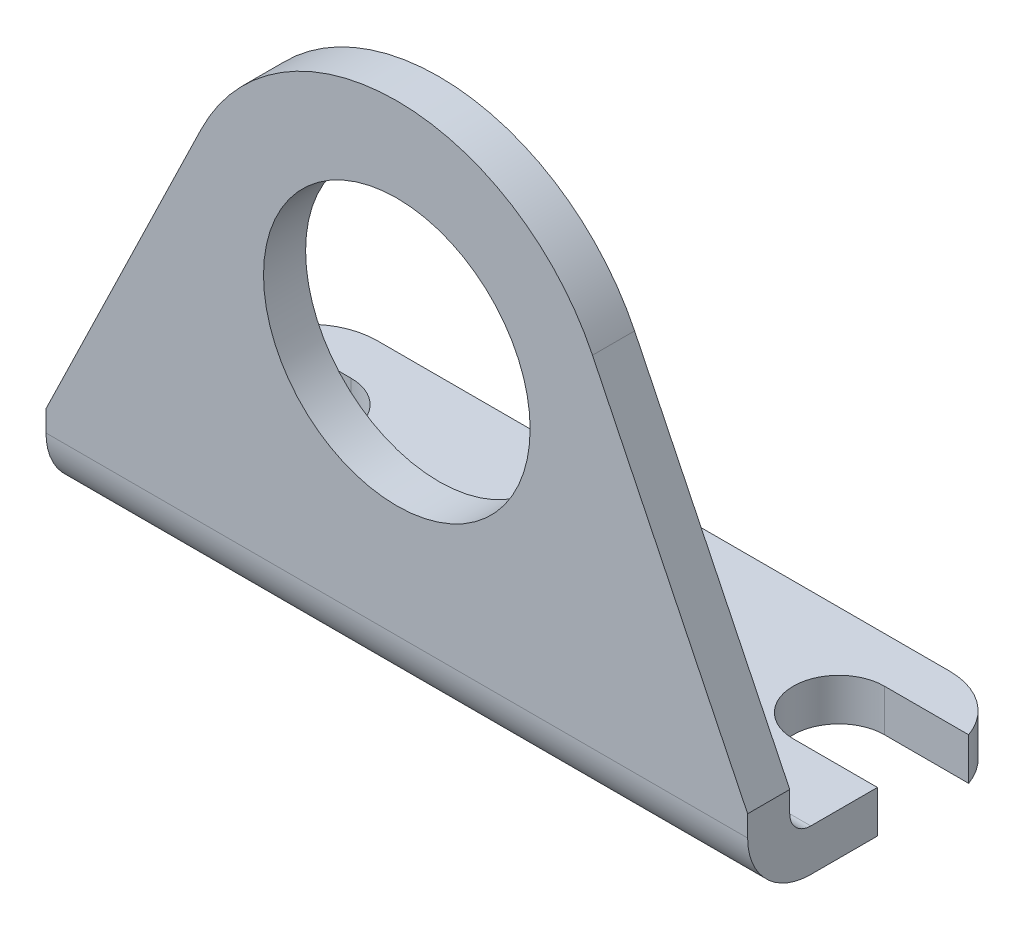
ISO-10303-21;
HEADER;
FILE_DESCRIPTION(('STEP AP214'),'2;1');
FILE_NAME('part.step','',(''),(''),'','','');
FILE_SCHEMA(('AUTOMOTIVE_DESIGN { 1 0 10303 214 1 1 1 1 }'));
ENDSEC;
DATA;
#1=APPLICATION_CONTEXT('core data for automotive mechanical design processes');
#2=APPLICATION_PROTOCOL_DEFINITION('international standard','automotive_design',2000,#1);
#3=PRODUCT_CONTEXT('',#1,'mechanical');
#4=PRODUCT('Part','Part','',(#3));
#5=PRODUCT_RELATED_PRODUCT_CATEGORY('part','',(#4));
#6=PRODUCT_DEFINITION_FORMATION('','',#4);
#7=PRODUCT_DEFINITION_CONTEXT('part definition',#1,'design');
#8=PRODUCT_DEFINITION('design','',#6,#7);
#9=PRODUCT_DEFINITION_SHAPE('','',#8);
#10=(LENGTH_UNIT() NAMED_UNIT(*) SI_UNIT(.MILLI.,.METRE.));
#11=(NAMED_UNIT(*) PLANE_ANGLE_UNIT() SI_UNIT($,.RADIAN.));
#12=(NAMED_UNIT(*) SI_UNIT($,.STERADIAN.) SOLID_ANGLE_UNIT());
#13=UNCERTAINTY_MEASURE_WITH_UNIT(LENGTH_MEASURE(1.E-05),#10,'distance_accuracy_value','');
#14=(GEOMETRIC_REPRESENTATION_CONTEXT(3) GLOBAL_UNCERTAINTY_ASSIGNED_CONTEXT((#13)) GLOBAL_UNIT_ASSIGNED_CONTEXT((#10,
#11,#12)) REPRESENTATION_CONTEXT('',''));
#15=CARTESIAN_POINT('',(0.,0.,0.));
#16=DIRECTION('',(0.,0.,1.));
#17=DIRECTION('',(1.,0.,0.));
#18=AXIS2_PLACEMENT_3D('',#15,#16,#17);
#19=CARTESIAN_POINT('',(-12.7,0.,6.35));
#20=DIRECTION('',(0.,1.,0.));
#21=DIRECTION('',(0.,0.,1.));
#22=AXIS2_PLACEMENT_3D('',#19,#20,#21);
#23=PLANE('',#22);
#24=DIRECTION('',(-1.,0.,0.));
#25=VECTOR('',#24,1.);
#26=CARTESIAN_POINT('',(-9.652,0.,-1.651));
#27=LINE('',#26,#25);
#28=CARTESIAN_POINT('',(-9.652,0.,-1.651));
#29=VERTEX_POINT('',#28);
#30=CARTESIAN_POINT('',(-12.6999999999999,0.,-1.651));
#31=VERTEX_POINT('',#30);
#32=EDGE_CURVE('E235',#29,#31,#27,.T.);
#33=ORIENTED_EDGE('',*,*,#32,.T.);
#34=CARTESIAN_POINT('',(-10.365133408522,0.,-0.825499999999999));
#35=DIRECTION('',(0.,1.,0.));
#36=DIRECTION('',(0.,0.,1.));
#37=AXIS2_PLACEMENT_3D('',#34,#35,#36);
#38=CIRCLE('',#37,2.4765);
#39=CARTESIAN_POINT('',(-10.365133408522,0.,-3.302));
#40=VERTEX_POINT('',#39);
#41=EDGE_CURVE('E204',#31,#40,#38,.F.);
#42=ORIENTED_EDGE('',*,*,#41,.T.);
#43=DIRECTION('',(1.,0.,0.));
#44=VECTOR('',#43,1.);
#45=CARTESIAN_POINT('',(-12.7,0.,-3.302));
#46=LINE('',#45,#44);
#47=CARTESIAN_POINT('',(10.365133408522,0.,-3.302));
#48=VERTEX_POINT('',#47);
#49=EDGE_CURVE('E211',#40,#48,#46,.T.);
#50=ORIENTED_EDGE('',*,*,#49,.T.);
#51=CARTESIAN_POINT('',(10.365133408522,0.,-0.825499999999999));
#52=DIRECTION('',(0.,1.,0.));
#53=DIRECTION('',(0.,0.,1.));
#54=AXIS2_PLACEMENT_3D('',#51,#52,#53);
#55=CIRCLE('',#54,2.4765);
#56=CARTESIAN_POINT('',(12.7,0.,-1.651));
#57=VERTEX_POINT('',#56);
#58=EDGE_CURVE('E197',#48,#57,#55,.F.);
#59=ORIENTED_EDGE('',*,*,#58,.T.);
#60=DIRECTION('',(-1.,0.,0.));
#61=VECTOR('',#60,1.);
#62=CARTESIAN_POINT('',(9.652,0.,-1.65099999999999));
#63=LINE('',#62,#61);
#64=CARTESIAN_POINT('',(9.652,0.,-1.65099999999999));
#65=VERTEX_POINT('',#64);
#66=EDGE_CURVE('E230',#57,#65,#63,.T.);
#67=ORIENTED_EDGE('',*,*,#66,.T.);
#68=CARTESIAN_POINT('',(9.652,0.,0.));
#69=DIRECTION('',(0.,1.,0.));
#70=DIRECTION('',(0.,0.,1.));
#71=AXIS2_PLACEMENT_3D('',#68,#69,#70);
#72=CIRCLE('',#71,1.65099999999999);
#73=CARTESIAN_POINT('',(9.652,0.,1.65099999999999));
#74=VERTEX_POINT('',#73);
#75=EDGE_CURVE('E284',#65,#74,#72,.T.);
#76=ORIENTED_EDGE('',*,*,#75,.T.);
#77=DIRECTION('',(1.,0.,0.));
#78=VECTOR('',#77,1.);
#79=CARTESIAN_POINT('',(9.652,0.,1.65099999999999));
#80=LINE('',#79,#78);
#81=CARTESIAN_POINT('',(12.7000000000001,0.,1.651));
#82=VERTEX_POINT('',#81);
#83=EDGE_CURVE('E185',#74,#82,#80,.T.);
#84=ORIENTED_EDGE('',*,*,#83,.T.);
#85=DIRECTION('',(0.,0.,-1.));
#86=VECTOR('',#85,1.);
#87=CARTESIAN_POINT('',(12.7,0.,6.35));
#88=LINE('',#87,#86);
#89=CARTESIAN_POINT('',(12.7000000000001,0.,4.064));
#90=VERTEX_POINT('',#89);
#91=EDGE_CURVE('E176',#90,#82,#88,.T.);
#92=ORIENTED_EDGE('',*,*,#91,.F.);
#93=DIRECTION('',(-1.,0.,0.));
#94=VECTOR('',#93,1.);
#95=CARTESIAN_POINT('',(12.7000000000001,0.,4.064));
#96=LINE('',#95,#94);
#97=CARTESIAN_POINT('',(-12.7,0.,4.064));
#98=VERTEX_POINT('',#97);
#99=EDGE_CURVE('E159',#90,#98,#96,.T.);
#100=ORIENTED_EDGE('',*,*,#99,.T.);
#101=DIRECTION('',(0.,0.,-1.));
#102=VECTOR('',#101,1.);
#103=CARTESIAN_POINT('',(-12.7,0.,6.35));
#104=LINE('',#103,#102);
#105=CARTESIAN_POINT('',(-12.7,0.,1.651));
#106=VERTEX_POINT('',#105);
#107=EDGE_CURVE('E186',#98,#106,#104,.T.);
#108=ORIENTED_EDGE('',*,*,#107,.T.);
#109=DIRECTION('',(1.,0.,0.));
#110=VECTOR('',#109,1.);
#111=CARTESIAN_POINT('',(-9.652,0.,1.651));
#112=LINE('',#111,#110);
#113=CARTESIAN_POINT('',(-9.652,0.,1.651));
#114=VERTEX_POINT('',#113);
#115=EDGE_CURVE('E237',#106,#114,#112,.T.);
#116=ORIENTED_EDGE('',*,*,#115,.T.);
#117=CARTESIAN_POINT('',(-9.652,0.,0.));
#118=DIRECTION('',(0.,1.,0.));
#119=DIRECTION('',(0.,0.,1.));
#120=AXIS2_PLACEMENT_3D('',#117,#118,#119);
#121=CIRCLE('',#120,1.651);
#122=EDGE_CURVE('E240',#114,#29,#121,.T.);
#123=ORIENTED_EDGE('',*,*,#122,.T.);
#124=EDGE_LOOP('',(#33,#42,#50,#59,#67,#76,#84,#92,#100,#108,#116,#123));
#125=FACE_BOUND('',#124,.T.);
#126=ADVANCED_FACE('F36',(#125),#23,.F.);
#127=CARTESIAN_POINT('',(0.,11.176,6.35));
#128=DIRECTION('',(0.,0.,1.));
#129=DIRECTION('',(1.,0.,0.));
#130=AXIS2_PLACEMENT_3D('',#127,#128,#129);
#131=PLANE('',#130);
#132=CARTESIAN_POINT('',(0.,11.176,6.35));
#133=DIRECTION('',(0.,0.,1.));
#134=DIRECTION('',(1.,0.,0.));
#135=AXIS2_PLACEMENT_3D('',#132,#133,#134);
#136=CIRCLE('',#135,4.826);
#137=CARTESIAN_POINT('',(4.826,11.176,6.35));
#138=VERTEX_POINT('',#137);
#139=EDGE_CURVE('E217',#138,#138,#136,.T.);
#140=ORIENTED_EDGE('',*,*,#139,.F.);
#141=EDGE_LOOP('',(#140));
#142=FACE_BOUND('',#141,.T.);
#143=DIRECTION('',(0.,-1.,0.));
#144=VECTOR('',#143,1.);
#145=CARTESIAN_POINT('',(-12.7,3.048,6.35));
#146=LINE('',#145,#144);
#147=CARTESIAN_POINT('',(-12.7,3.048,6.35));
#148=VERTEX_POINT('',#147);
#149=CARTESIAN_POINT('',(-12.7,2.286,6.35));
#150=VERTEX_POINT('',#149);
#151=EDGE_CURVE('E254',#148,#150,#146,.T.);
#152=ORIENTED_EDGE('',*,*,#151,.T.);
#153=DIRECTION('',(-1.,0.,0.));
#154=VECTOR('',#153,1.);
#155=CARTESIAN_POINT('',(12.7000000000001,2.286,6.35));
#156=LINE('',#155,#154);
#157=CARTESIAN_POINT('',(12.7,2.286,6.35));
#158=VERTEX_POINT('',#157);
#159=EDGE_CURVE('E170',#158,#150,#156,.T.);
#160=ORIENTED_EDGE('',*,*,#159,.F.);
#161=DIRECTION('',(0.,1.,0.));
#162=VECTOR('',#161,1.);
#163=CARTESIAN_POINT('',(12.7,0.,6.35));
#164=LINE('',#163,#162);
#165=CARTESIAN_POINT('',(12.7,3.048,6.35));
#166=VERTEX_POINT('',#165);
#167=EDGE_CURVE('E179',#158,#166,#164,.T.);
#168=ORIENTED_EDGE('',*,*,#167,.T.);
#169=DIRECTION('',(-0.436805905723444,0.899555779663008,0.));
#170=VECTOR('',#169,1.);
#171=CARTESIAN_POINT('',(12.7,3.048,6.35));
#172=LINE('',#171,#170);
#173=CARTESIAN_POINT('',(7.08310220906653,14.6154097016664,6.35));
#174=VERTEX_POINT('',#173);
#175=EDGE_CURVE('E258',#166,#174,#172,.T.);
#176=ORIENTED_EDGE('',*,*,#175,.T.);
#177=CARTESIAN_POINT('',(0.,11.176,6.35));
#178=DIRECTION('',(0.,0.,1.));
#179=DIRECTION('',(1.,0.,0.));
#180=AXIS2_PLACEMENT_3D('',#177,#178,#179);
#181=CIRCLE('',#180,7.87400000000001);
#182=CARTESIAN_POINT('',(-7.08310220906653,14.6154097016664,6.35));
#183=VERTEX_POINT('',#182);
#184=EDGE_CURVE('E260',#174,#183,#181,.T.);
#185=ORIENTED_EDGE('',*,*,#184,.T.);
#186=DIRECTION('',(-0.436805905723444,-0.899555779663008,0.));
#187=VECTOR('',#186,1.);
#188=CARTESIAN_POINT('',(-7.08310220906653,14.6154097016664,6.35));
#189=LINE('',#188,#187);
#190=EDGE_CURVE('E262',#183,#148,#189,.T.);
#191=ORIENTED_EDGE('',*,*,#190,.T.);
#192=EDGE_LOOP('',(#152,#160,#168,#176,#185,#191));
#193=FACE_BOUND('',#192,.T.);
#194=ADVANCED_FACE('F370',(#142,#193),#131,.T.);
#195=CARTESIAN_POINT('',(12.7,0.,6.35));
#196=DIRECTION('',(-1.,0.,0.));
#197=DIRECTION('',(0.,0.,1.));
#198=AXIS2_PLACEMENT_3D('',#195,#196,#197);
#199=PLANE('',#198);
#200=ORIENTED_EDGE('',*,*,#167,.F.);
#201=CARTESIAN_POINT('',(12.7000000000001,2.286,4.064));
#202=DIRECTION('',(1.,0.,0.));
#203=DIRECTION('',(0.,0.,1.));
#204=AXIS2_PLACEMENT_3D('',#201,#202,#203);
#205=CIRCLE('',#204,2.286);
#206=EDGE_CURVE('E162',#158,#90,#205,.T.);
#207=ORIENTED_EDGE('',*,*,#206,.T.);
#208=ORIENTED_EDGE('',*,*,#91,.T.);
#209=DIRECTION('',(0.,-1.,0.));
#210=VECTOR('',#209,1.);
#211=CARTESIAN_POINT('',(12.7000000000001,19.05,1.651));
#212=LINE('',#211,#210);
#213=CARTESIAN_POINT('',(12.7000000000001,1.524,1.651));
#214=VERTEX_POINT('',#213);
#215=EDGE_CURVE('E225',#214,#82,#212,.T.);
#216=ORIENTED_EDGE('',*,*,#215,.F.);
#217=DIRECTION('',(0.,0.,1.));
#218=VECTOR('',#217,1.);
#219=CARTESIAN_POINT('',(12.7000000000001,1.524,-3.302));
#220=LINE('',#219,#218);
#221=CARTESIAN_POINT('',(12.7000000000001,1.524,4.064));
#222=VERTEX_POINT('',#221);
#223=EDGE_CURVE('E306',#214,#222,#220,.T.);
#224=ORIENTED_EDGE('',*,*,#223,.T.);
#225=CARTESIAN_POINT('',(12.7000000000001,2.286,4.064));
#226=DIRECTION('',(-1.,0.,0.));
#227=DIRECTION('',(0.,0.,1.));
#228=AXIS2_PLACEMENT_3D('',#225,#226,#227);
#229=CIRCLE('',#228,0.762000000000001);
#230=CARTESIAN_POINT('',(12.7000000000001,2.286,4.826));
#231=VERTEX_POINT('',#230);
#232=EDGE_CURVE('E308',#222,#231,#229,.T.);
#233=ORIENTED_EDGE('',*,*,#232,.T.);
#234=DIRECTION('',(0.,1.,0.));
#235=VECTOR('',#234,1.);
#236=CARTESIAN_POINT('',(12.7000000000001,19.05,4.826));
#237=LINE('',#236,#235);
#238=CARTESIAN_POINT('',(12.7000000000001,3.0479999999998,4.826));
#239=VERTEX_POINT('',#238);
#240=EDGE_CURVE('E311',#231,#239,#237,.T.);
#241=ORIENTED_EDGE('',*,*,#240,.T.);
#242=DIRECTION('',(0.,0.,-1.));
#243=VECTOR('',#242,1.);
#244=CARTESIAN_POINT('',(12.7,3.048,6.35));
#245=LINE('',#244,#243);
#246=EDGE_CURVE('E187',#166,#239,#245,.T.);
#247=ORIENTED_EDGE('',*,*,#246,.F.);
#248=EDGE_LOOP('',(#200,#207,#208,#216,#224,#233,#241,#247));
#249=FACE_BOUND('',#248,.T.);
#250=ADVANCED_FACE('F174',(#249),#199,.F.);
#251=CARTESIAN_POINT('',(12.7,3.048,6.35));
#252=DIRECTION('',(-0.899555779663008,-0.436805905723444,0.));
#253=DIRECTION('',(0.436805905723444,-0.899555779663008,0.));
#254=AXIS2_PLACEMENT_3D('',#251,#252,#253);
#255=PLANE('',#254);
#256=ORIENTED_EDGE('',*,*,#246,.T.);
#257=DIRECTION('',(-0.436805905723444,0.899555779663008,0.));
#258=VECTOR('',#257,1.);
#259=CARTESIAN_POINT('',(12.7,3.048,4.826));
#260=LINE('',#259,#258);
#261=CARTESIAN_POINT('',(7.08310220906653,14.6154097016664,4.826));
#262=VERTEX_POINT('',#261);
#263=EDGE_CURVE('E280',#239,#262,#260,.T.);
#264=ORIENTED_EDGE('',*,*,#263,.T.);
#265=DIRECTION('',(0.,0.,-1.));
#266=VECTOR('',#265,1.);
#267=CARTESIAN_POINT('',(7.08310220906653,14.6154097016664,6.35));
#268=LINE('',#267,#266);
#269=EDGE_CURVE('E192',#174,#262,#268,.T.);
#270=ORIENTED_EDGE('',*,*,#269,.F.);
#271=ORIENTED_EDGE('',*,*,#175,.F.);
#272=EDGE_LOOP('',(#256,#264,#270,#271));
#273=FACE_BOUND('',#272,.T.);
#274=ADVANCED_FACE('F279',(#273),#255,.F.);
#275=CARTESIAN_POINT('',(-12.7,3.048,6.35));
#276=DIRECTION('',(1.,0.,0.));
#277=DIRECTION('',(0.,0.,-1.));
#278=AXIS2_PLACEMENT_3D('',#275,#276,#277);
#279=PLANE('',#278);
#280=ORIENTED_EDGE('',*,*,#107,.F.);
#281=CARTESIAN_POINT('',(-12.7,2.286,4.064));
#282=DIRECTION('',(1.,0.,0.));
#283=DIRECTION('',(0.,0.,1.));
#284=AXIS2_PLACEMENT_3D('',#281,#282,#283);
#285=CIRCLE('',#284,2.286);
#286=EDGE_CURVE('E165',#150,#98,#285,.T.);
#287=ORIENTED_EDGE('',*,*,#286,.F.);
#288=ORIENTED_EDGE('',*,*,#151,.F.);
#289=DIRECTION('',(0.,0.,-1.));
#290=VECTOR('',#289,1.);
#291=CARTESIAN_POINT('',(-12.7,3.048,6.35));
#292=LINE('',#291,#290);
#293=CARTESIAN_POINT('',(-12.7,3.048,4.826));
#294=VERTEX_POINT('',#293);
#295=EDGE_CURVE('E264',#148,#294,#292,.T.);
#296=ORIENTED_EDGE('',*,*,#295,.T.);
#297=DIRECTION('',(0.,1.,0.));
#298=VECTOR('',#297,1.);
#299=CARTESIAN_POINT('',(-12.7,19.05,4.826));
#300=LINE('',#299,#298);
#301=CARTESIAN_POINT('',(-12.7,2.286,4.826));
#302=VERTEX_POINT('',#301);
#303=EDGE_CURVE('E309',#302,#294,#300,.T.);
#304=ORIENTED_EDGE('',*,*,#303,.F.);
#305=CARTESIAN_POINT('',(-12.7,2.286,4.064));
#306=DIRECTION('',(-1.,0.,0.));
#307=DIRECTION('',(0.,0.,1.));
#308=AXIS2_PLACEMENT_3D('',#305,#306,#307);
#309=CIRCLE('',#308,0.762000000000001);
#310=CARTESIAN_POINT('',(-12.7,1.524,4.064));
#311=VERTEX_POINT('',#310);
#312=EDGE_CURVE('E313',#311,#302,#309,.T.);
#313=ORIENTED_EDGE('',*,*,#312,.F.);
#314=DIRECTION('',(0.,0.,1.));
#315=VECTOR('',#314,1.);
#316=CARTESIAN_POINT('',(-12.7,1.524,-3.302));
#317=LINE('',#316,#315);
#318=CARTESIAN_POINT('',(-12.7,1.524,1.651));
#319=VERTEX_POINT('',#318);
#320=EDGE_CURVE('E169',#319,#311,#317,.T.);
#321=ORIENTED_EDGE('',*,*,#320,.F.);
#322=DIRECTION('',(0.,-1.,0.));
#323=VECTOR('',#322,1.);
#324=CARTESIAN_POINT('',(-12.7,19.05,1.651));
#325=LINE('',#324,#323);
#326=EDGE_CURVE('E247',#319,#106,#325,.T.);
#327=ORIENTED_EDGE('',*,*,#326,.T.);
#328=EDGE_LOOP('',(#280,#287,#288,#296,#304,#313,#321,#327));
#329=FACE_BOUND('',#328,.T.);
#330=ADVANCED_FACE('F354',(#329),#279,.F.);
#331=CARTESIAN_POINT('',(-7.08310220906653,14.6154097016664,6.35));
#332=DIRECTION('',(0.899555779663008,-0.436805905723444,0.));
#333=DIRECTION('',(0.436805905723444,0.899555779663008,0.));
#334=AXIS2_PLACEMENT_3D('',#331,#332,#333);
#335=PLANE('',#334);
#336=DIRECTION('',(0.,0.,-1.));
#337=VECTOR('',#336,1.);
#338=CARTESIAN_POINT('',(-7.08310220906653,14.6154097016664,6.35));
#339=LINE('',#338,#337);
#340=CARTESIAN_POINT('',(-7.08310220906653,14.6154097016664,4.826));
#341=VERTEX_POINT('',#340);
#342=EDGE_CURVE('E267',#183,#341,#339,.T.);
#343=ORIENTED_EDGE('',*,*,#342,.T.);
#344=DIRECTION('',(-0.436805905723444,-0.899555779663008,0.));
#345=VECTOR('',#344,1.);
#346=CARTESIAN_POINT('',(-7.08310220906653,14.6154097016664,4.826));
#347=LINE('',#346,#345);
#348=EDGE_CURVE('E285',#341,#294,#347,.T.);
#349=ORIENTED_EDGE('',*,*,#348,.T.);
#350=ORIENTED_EDGE('',*,*,#295,.F.);
#351=ORIENTED_EDGE('',*,*,#190,.F.);
#352=EDGE_LOOP('',(#343,#349,#350,#351));
#353=FACE_BOUND('',#352,.T.);
#354=ADVANCED_FACE('F381',(#353),#335,.F.);
#355=CARTESIAN_POINT('',(0.,11.176,6.35));
#356=DIRECTION('',(0.,0.,-1.));
#357=DIRECTION('',(-1.,0.,0.));
#358=AXIS2_PLACEMENT_3D('',#355,#356,#357);
#359=CYLINDRICAL_SURFACE('',#358,7.87400000000001);
#360=CARTESIAN_POINT('',(0.,11.176,4.826));
#361=DIRECTION('',(0.,0.,1.));
#362=DIRECTION('',(0.,-1.,0.));
#363=AXIS2_PLACEMENT_3D('',#360,#361,#362);
#364=CIRCLE('',#363,7.87400000000001);
#365=EDGE_CURVE('E201',#262,#341,#364,.T.);
#366=ORIENTED_EDGE('',*,*,#365,.T.);
#367=ORIENTED_EDGE('',*,*,#342,.F.);
#368=ORIENTED_EDGE('',*,*,#184,.F.);
#369=ORIENTED_EDGE('',*,*,#269,.T.);
#370=EDGE_LOOP('',(#366,#367,#368,#369));
#371=FACE_BOUND('',#370,.T.);
#372=ADVANCED_FACE('F273',(#371),#359,.T.);
#373=CARTESIAN_POINT('',(0.,11.176,6.35));
#374=DIRECTION('',(0.,0.,-1.));
#375=DIRECTION('',(-1.,0.,0.));
#376=AXIS2_PLACEMENT_3D('',#373,#374,#375);
#377=CYLINDRICAL_SURFACE('',#376,4.826);
#378=CARTESIAN_POINT('',(0.,11.176,4.826));
#379=DIRECTION('',(0.,0.,1.));
#380=DIRECTION('',(0.,-1.,0.));
#381=AXIS2_PLACEMENT_3D('',#378,#379,#380);
#382=CIRCLE('',#381,4.826);
#383=CARTESIAN_POINT('',(0.,6.35,4.826));
#384=VERTEX_POINT('',#383);
#385=EDGE_CURVE('E198',#384,#384,#382,.T.);
#386=ORIENTED_EDGE('',*,*,#385,.F.);
#387=EDGE_LOOP('',(#386));
#388=FACE_BOUND('',#387,.T.);
#389=ORIENTED_EDGE('',*,*,#139,.T.);
#390=EDGE_LOOP('',(#389));
#391=FACE_BOUND('',#390,.T.);
#392=ADVANCED_FACE('F408',(#388,#391),#377,.F.);
#393=CARTESIAN_POINT('',(0.,11.176,-3.302));
#394=DIRECTION('',(0.,0.,1.));
#395=DIRECTION('',(1.,0.,0.));
#396=AXIS2_PLACEMENT_3D('',#393,#394,#395);
#397=PLANE('',#396);
#398=ORIENTED_EDGE('',*,*,#49,.F.);
#399=DIRECTION('',(0.,-1.,0.));
#400=VECTOR('',#399,1.);
#401=CARTESIAN_POINT('',(-10.365133408522,11.176,-3.302));
#402=LINE('',#401,#400);
#403=CARTESIAN_POINT('',(-10.365133408522,1.524,-3.302));
#404=VERTEX_POINT('',#403);
#405=EDGE_CURVE('E51',#40,#404,#402,.F.);
#406=ORIENTED_EDGE('',*,*,#405,.T.);
#407=DIRECTION('',(-1.,0.,0.));
#408=VECTOR('',#407,1.);
#409=CARTESIAN_POINT('',(12.7000000000001,1.524,-3.302));
#410=LINE('',#409,#408);
#411=CARTESIAN_POINT('',(10.365133408522,1.524,-3.302));
#412=VERTEX_POINT('',#411);
#413=EDGE_CURVE('E212',#412,#404,#410,.T.);
#414=ORIENTED_EDGE('',*,*,#413,.F.);
#415=DIRECTION('',(0.,1.,0.));
#416=VECTOR('',#415,1.);
#417=CARTESIAN_POINT('',(10.365133408522,11.176,-3.302));
#418=LINE('',#417,#416);
#419=EDGE_CURVE('E206',#412,#48,#418,.F.);
#420=ORIENTED_EDGE('',*,*,#419,.T.);
#421=EDGE_LOOP('',(#398,#406,#414,#420));
#422=FACE_BOUND('',#421,.T.);
#423=ADVANCED_FACE('F210',(#422),#397,.F.);
#424=CARTESIAN_POINT('',(-9.652,19.05,-1.651));
#425=DIRECTION('',(0.,0.,1.));
#426=DIRECTION('',(1.,0.,0.));
#427=AXIS2_PLACEMENT_3D('',#424,#425,#426);
#428=PLANE('',#427);
#429=DIRECTION('',(1.,0.,0.));
#430=VECTOR('',#429,1.);
#431=CARTESIAN_POINT('',(-9.652,1.524,-1.651));
#432=LINE('',#431,#430);
#433=CARTESIAN_POINT('',(-12.7,1.524,-1.651));
#434=VERTEX_POINT('',#433);
#435=CARTESIAN_POINT('',(-9.652,1.524,-1.651));
#436=VERTEX_POINT('',#435);
#437=EDGE_CURVE('E202',#434,#436,#432,.T.);
#438=ORIENTED_EDGE('',*,*,#437,.F.);
#439=DIRECTION('',(0.,-1.,0.));
#440=VECTOR('',#439,1.);
#441=CARTESIAN_POINT('',(-12.6999999999999,19.05,-1.651));
#442=LINE('',#441,#440);
#443=EDGE_CURVE('E218',#434,#31,#442,.T.);
#444=ORIENTED_EDGE('',*,*,#443,.T.);
#445=ORIENTED_EDGE('',*,*,#32,.F.);
#446=DIRECTION('',(0.,-1.,0.));
#447=VECTOR('',#446,1.);
#448=CARTESIAN_POINT('',(-9.652,19.05,-1.651));
#449=LINE('',#448,#447);
#450=EDGE_CURVE('E243',#436,#29,#449,.T.);
#451=ORIENTED_EDGE('',*,*,#450,.F.);
#452=EDGE_LOOP('',(#438,#444,#445,#451));
#453=FACE_BOUND('',#452,.T.);
#454=ADVANCED_FACE('F346',(#453),#428,.T.);
#455=CARTESIAN_POINT('',(-9.652,19.05,1.651));
#456=DIRECTION('',(0.,0.,-1.));
#457=DIRECTION('',(-1.,0.,0.));
#458=AXIS2_PLACEMENT_3D('',#455,#456,#457);
#459=PLANE('',#458);
#460=DIRECTION('',(-1.,0.,0.));
#461=VECTOR('',#460,1.);
#462=CARTESIAN_POINT('',(-9.652,1.524,1.651));
#463=LINE('',#462,#461);
#464=CARTESIAN_POINT('',(-9.652,1.524,1.651));
#465=VERTEX_POINT('',#464);
#466=EDGE_CURVE('E331',#465,#319,#463,.T.);
#467=ORIENTED_EDGE('',*,*,#466,.F.);
#468=DIRECTION('',(0.,-1.,0.));
#469=VECTOR('',#468,1.);
#470=CARTESIAN_POINT('',(-9.652,19.05,1.651));
#471=LINE('',#470,#469);
#472=EDGE_CURVE('E245',#465,#114,#471,.T.);
#473=ORIENTED_EDGE('',*,*,#472,.T.);
#474=ORIENTED_EDGE('',*,*,#115,.F.);
#475=ORIENTED_EDGE('',*,*,#326,.F.);
#476=EDGE_LOOP('',(#467,#473,#474,#475));
#477=FACE_BOUND('',#476,.T.);
#478=ADVANCED_FACE('F350',(#477),#459,.T.);
#479=CARTESIAN_POINT('',(-9.652,19.05,0.));
#480=DIRECTION('',(0.,-1.,0.));
#481=DIRECTION('',(0.,0.,-1.));
#482=AXIS2_PLACEMENT_3D('',#479,#480,#481);
#483=CYLINDRICAL_SURFACE('',#482,1.651);
#484=CARTESIAN_POINT('',(-9.652,1.524,0.));
#485=DIRECTION('',(0.,-1.,0.));
#486=DIRECTION('',(0.,0.,-1.));
#487=AXIS2_PLACEMENT_3D('',#484,#485,#486);
#488=CIRCLE('',#487,1.651);
#489=EDGE_CURVE('E329',#436,#465,#488,.T.);
#490=ORIENTED_EDGE('',*,*,#489,.F.);
#491=ORIENTED_EDGE('',*,*,#450,.T.);
#492=ORIENTED_EDGE('',*,*,#122,.F.);
#493=ORIENTED_EDGE('',*,*,#472,.F.);
#494=EDGE_LOOP('',(#490,#491,#492,#493));
#495=FACE_BOUND('',#494,.T.);
#496=ADVANCED_FACE('F343',(#495),#483,.F.);
#497=CARTESIAN_POINT('',(9.652,19.05,0.));
#498=DIRECTION('',(0.,-1.,0.));
#499=DIRECTION('',(0.,0.,-1.));
#500=AXIS2_PLACEMENT_3D('',#497,#498,#499);
#501=CYLINDRICAL_SURFACE('',#500,1.65099999999999);
#502=CARTESIAN_POINT('',(9.652,1.524,0.));
#503=DIRECTION('',(0.,-1.,0.));
#504=DIRECTION('',(0.,0.,-1.));
#505=AXIS2_PLACEMENT_3D('',#502,#503,#504);
#506=CIRCLE('',#505,1.65099999999999);
#507=CARTESIAN_POINT('',(9.652,1.524,1.65099999999999));
#508=VERTEX_POINT('',#507);
#509=CARTESIAN_POINT('',(9.652,1.524,-1.65099999999999));
#510=VERTEX_POINT('',#509);
#511=EDGE_CURVE('E299',#508,#510,#506,.T.);
#512=ORIENTED_EDGE('',*,*,#511,.F.);
#513=DIRECTION('',(0.,-1.,0.));
#514=VECTOR('',#513,1.);
#515=CARTESIAN_POINT('',(9.652,19.05,1.65099999999999));
#516=LINE('',#515,#514);
#517=EDGE_CURVE('E228',#508,#74,#516,.T.);
#518=ORIENTED_EDGE('',*,*,#517,.T.);
#519=ORIENTED_EDGE('',*,*,#75,.F.);
#520=DIRECTION('',(0.,-1.,0.));
#521=VECTOR('',#520,1.);
#522=CARTESIAN_POINT('',(9.652,19.05,-1.65099999999999));
#523=LINE('',#522,#521);
#524=EDGE_CURVE('E226',#510,#65,#523,.T.);
#525=ORIENTED_EDGE('',*,*,#524,.F.);
#526=EDGE_LOOP('',(#512,#518,#519,#525));
#527=FACE_BOUND('',#526,.T.);
#528=ADVANCED_FACE('F297',(#527),#501,.F.);
#529=CARTESIAN_POINT('',(9.652,19.05,1.65099999999999));
#530=DIRECTION('',(0.,0.,-1.));
#531=DIRECTION('',(-1.,0.,0.));
#532=AXIS2_PLACEMENT_3D('',#529,#530,#531);
#533=PLANE('',#532);
#534=DIRECTION('',(-1.,0.,0.));
#535=VECTOR('',#534,1.);
#536=CARTESIAN_POINT('',(9.652,1.524,1.65099999999999));
#537=LINE('',#536,#535);
#538=EDGE_CURVE('E303',#214,#508,#537,.T.);
#539=ORIENTED_EDGE('',*,*,#538,.F.);
#540=ORIENTED_EDGE('',*,*,#215,.T.);
#541=ORIENTED_EDGE('',*,*,#83,.F.);
#542=ORIENTED_EDGE('',*,*,#517,.F.);
#543=EDGE_LOOP('',(#539,#540,#541,#542));
#544=FACE_BOUND('',#543,.T.);
#545=ADVANCED_FACE('F302',(#544),#533,.T.);
#546=CARTESIAN_POINT('',(9.652,19.05,-1.65099999999999));
#547=DIRECTION('',(0.,0.,1.));
#548=DIRECTION('',(1.,0.,0.));
#549=AXIS2_PLACEMENT_3D('',#546,#547,#548);
#550=PLANE('',#549);
#551=DIRECTION('',(1.,0.,0.));
#552=VECTOR('',#551,1.);
#553=CARTESIAN_POINT('',(9.652,1.524,-1.65099999999999));
#554=LINE('',#553,#552);
#555=CARTESIAN_POINT('',(12.7000000000001,1.524,-1.651));
#556=VERTEX_POINT('',#555);
#557=EDGE_CURVE('E189',#510,#556,#554,.T.);
#558=ORIENTED_EDGE('',*,*,#557,.F.);
#559=ORIENTED_EDGE('',*,*,#524,.T.);
#560=ORIENTED_EDGE('',*,*,#66,.F.);
#561=DIRECTION('',(0.,-1.,0.));
#562=VECTOR('',#561,1.);
#563=CARTESIAN_POINT('',(12.7,19.05,-1.651));
#564=LINE('',#563,#562);
#565=EDGE_CURVE('E222',#556,#57,#564,.T.);
#566=ORIENTED_EDGE('',*,*,#565,.F.);
#567=EDGE_LOOP('',(#558,#559,#560,#566));
#568=FACE_BOUND('',#567,.T.);
#569=ADVANCED_FACE('F293',(#568),#550,.T.);
#570=CARTESIAN_POINT('',(12.7000000000001,19.05,4.826));
#571=DIRECTION('',(0.,0.,1.));
#572=DIRECTION('',(0.,-1.,0.));
#573=AXIS2_PLACEMENT_3D('',#570,#571,#572);
#574=PLANE('',#573);
#575=ORIENTED_EDGE('',*,*,#385,.T.);
#576=EDGE_LOOP('',(#575));
#577=FACE_BOUND('',#576,.T.);
#578=ORIENTED_EDGE('',*,*,#240,.F.);
#579=DIRECTION('',(-1.,0.,0.));
#580=VECTOR('',#579,1.);
#581=CARTESIAN_POINT('',(12.7000000000001,2.286,4.826));
#582=LINE('',#581,#580);
#583=EDGE_CURVE('E321',#231,#302,#582,.T.);
#584=ORIENTED_EDGE('',*,*,#583,.T.);
#585=ORIENTED_EDGE('',*,*,#303,.T.);
#586=ORIENTED_EDGE('',*,*,#348,.F.);
#587=ORIENTED_EDGE('',*,*,#365,.F.);
#588=ORIENTED_EDGE('',*,*,#263,.F.);
#589=EDGE_LOOP('',(#578,#584,#585,#586,#587,#588));
#590=FACE_BOUND('',#589,.T.);
#591=ADVANCED_FACE('F358',(#577,#590),#574,.F.);
#592=CARTESIAN_POINT('',(12.7000000000001,2.286,4.064));
#593=DIRECTION('',(-1.,0.,0.));
#594=DIRECTION('',(0.,0.,1.));
#595=AXIS2_PLACEMENT_3D('',#592,#593,#594);
#596=CYLINDRICAL_SURFACE('',#595,0.762000000000001);
#597=ORIENTED_EDGE('',*,*,#312,.T.);
#598=ORIENTED_EDGE('',*,*,#583,.F.);
#599=ORIENTED_EDGE('',*,*,#232,.F.);
#600=DIRECTION('',(-1.,0.,0.));
#601=VECTOR('',#600,1.);
#602=CARTESIAN_POINT('',(12.7000000000001,1.524,4.064));
#603=LINE('',#602,#601);
#604=EDGE_CURVE('E323',#222,#311,#603,.T.);
#605=ORIENTED_EDGE('',*,*,#604,.T.);
#606=EDGE_LOOP('',(#597,#598,#599,#605));
#607=FACE_BOUND('',#606,.T.);
#608=ADVANCED_FACE('F357',(#607),#596,.F.);
#609=CARTESIAN_POINT('',(12.7000000000001,1.524,-3.302));
#610=DIRECTION('',(0.,-1.,0.));
#611=DIRECTION('',(0.,0.,-1.));
#612=AXIS2_PLACEMENT_3D('',#609,#610,#611);
#613=PLANE('',#612);
#614=ORIENTED_EDGE('',*,*,#413,.T.);
#615=CARTESIAN_POINT('',(-10.365133408522,1.524,-0.825499999999999));
#616=DIRECTION('',(0.,-1.,0.));
#617=DIRECTION('',(0.,0.,-1.));
#618=AXIS2_PLACEMENT_3D('',#615,#616,#617);
#619=CIRCLE('',#618,2.4765);
#620=EDGE_CURVE('E11',#404,#434,#619,.F.);
#621=ORIENTED_EDGE('',*,*,#620,.T.);
#622=ORIENTED_EDGE('',*,*,#437,.T.);
#623=ORIENTED_EDGE('',*,*,#489,.T.);
#624=ORIENTED_EDGE('',*,*,#466,.T.);
#625=ORIENTED_EDGE('',*,*,#320,.T.);
#626=ORIENTED_EDGE('',*,*,#604,.F.);
#627=ORIENTED_EDGE('',*,*,#223,.F.);
#628=ORIENTED_EDGE('',*,*,#538,.T.);
#629=ORIENTED_EDGE('',*,*,#511,.T.);
#630=ORIENTED_EDGE('',*,*,#557,.T.);
#631=CARTESIAN_POINT('',(10.365133408522,1.524,-0.825499999999999));
#632=DIRECTION('',(0.,-1.,0.));
#633=DIRECTION('',(0.,0.,-1.));
#634=AXIS2_PLACEMENT_3D('',#631,#632,#633);
#635=CIRCLE('',#634,2.4765);
#636=EDGE_CURVE('E44',#556,#412,#635,.F.);
#637=ORIENTED_EDGE('',*,*,#636,.T.);
#638=EDGE_LOOP('',(#614,#621,#622,#623,#624,#625,#626,#627,#628,#629,#630,#637));
#639=FACE_BOUND('',#638,.T.);
#640=ADVANCED_FACE('F335',(#639),#613,.F.);
#641=CARTESIAN_POINT('',(12.7000000000001,2.286,4.064));
#642=DIRECTION('',(-1.,0.,0.));
#643=DIRECTION('',(0.,0.,1.));
#644=AXIS2_PLACEMENT_3D('',#641,#642,#643);
#645=CYLINDRICAL_SURFACE('',#644,2.286);
#646=ORIENTED_EDGE('',*,*,#286,.T.);
#647=ORIENTED_EDGE('',*,*,#99,.F.);
#648=ORIENTED_EDGE('',*,*,#206,.F.);
#649=ORIENTED_EDGE('',*,*,#159,.T.);
#650=EDGE_LOOP('',(#646,#647,#648,#649));
#651=FACE_BOUND('',#650,.T.);
#652=ADVANCED_FACE('F161',(#651),#645,.T.);
#653=CARTESIAN_POINT('',(-10.365133408522,3.048,-0.825499999999999));
#654=DIRECTION('',(0.,-1.,0.));
#655=DIRECTION('',(0.,0.,-1.));
#656=AXIS2_PLACEMENT_3D('',#653,#654,#655);
#657=CYLINDRICAL_SURFACE('',#656,2.4765);
#658=ORIENTED_EDGE('',*,*,#620,.F.);
#659=ORIENTED_EDGE('',*,*,#405,.F.);
#660=ORIENTED_EDGE('',*,*,#41,.F.);
#661=ORIENTED_EDGE('',*,*,#443,.F.);
#662=EDGE_LOOP('',(#658,#659,#660,#661));
#663=FACE_BOUND('',#662,.T.);
#664=ADVANCED_FACE('F382',(#663),#657,.T.);
#665=CARTESIAN_POINT('',(10.365133408522,0.,-0.825499999999999));
#666=DIRECTION('',(0.,1.,0.));
#667=DIRECTION('',(0.,0.,1.));
#668=AXIS2_PLACEMENT_3D('',#665,#666,#667);
#669=CYLINDRICAL_SURFACE('',#668,2.4765);
#670=ORIENTED_EDGE('',*,*,#58,.F.);
#671=ORIENTED_EDGE('',*,*,#419,.F.);
#672=ORIENTED_EDGE('',*,*,#636,.F.);
#673=ORIENTED_EDGE('',*,*,#565,.T.);
#674=EDGE_LOOP('',(#670,#671,#672,#673));
#675=FACE_BOUND('',#674,.T.);
#676=ADVANCED_FACE('F38',(#675),#669,.T.);
#677=CLOSED_SHELL('',(#126,#194,#250,#274,#330,#354,#372,#392,#423,#454,#478,#496,#528,#545,
#569,#591,#608,#640,#652,#664,#676));
#678=MANIFOLD_SOLID_BREP('B2',#677);
#679=ADVANCED_BREP_SHAPE_REPRESENTATION('',(#18,#678),#14);
#680=SHAPE_DEFINITION_REPRESENTATION(#9,#679);
ENDSEC;
END-ISO-10303-21;
